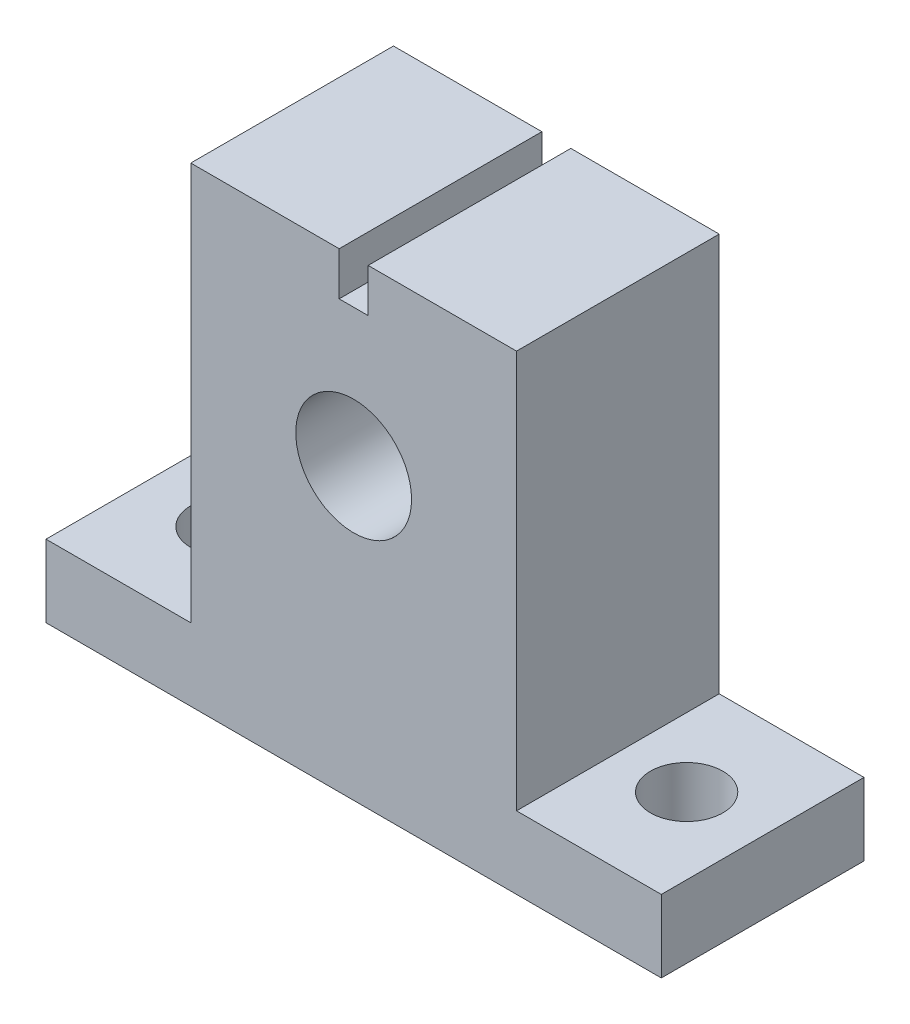
ISO-10303-21;
HEADER;
FILE_DESCRIPTION(('STEP AP214'),'2;1');
FILE_NAME('part.step','',(''),(''),'','','');
FILE_SCHEMA(('AUTOMOTIVE_DESIGN { 1 0 10303 214 1 1 1 1 }'));
ENDSEC;
DATA;
#1=APPLICATION_CONTEXT('core data for automotive mechanical design processes');
#2=APPLICATION_PROTOCOL_DEFINITION('international standard','automotive_design',2000,#1);
#3=PRODUCT_CONTEXT('',#1,'mechanical');
#4=PRODUCT('Part','Part','',(#3));
#5=PRODUCT_RELATED_PRODUCT_CATEGORY('part','',(#4));
#6=PRODUCT_DEFINITION_FORMATION('','',#4);
#7=PRODUCT_DEFINITION_CONTEXT('part definition',#1,'design');
#8=PRODUCT_DEFINITION('design','',#6,#7);
#9=PRODUCT_DEFINITION_SHAPE('','',#8);
#10=(LENGTH_UNIT() NAMED_UNIT(*) SI_UNIT(.MILLI.,.METRE.));
#11=(NAMED_UNIT(*) PLANE_ANGLE_UNIT() SI_UNIT($,.RADIAN.));
#12=(NAMED_UNIT(*) SI_UNIT($,.STERADIAN.) SOLID_ANGLE_UNIT());
#13=UNCERTAINTY_MEASURE_WITH_UNIT(LENGTH_MEASURE(1.E-05),#10,'distance_accuracy_value','');
#14=(GEOMETRIC_REPRESENTATION_CONTEXT(3) GLOBAL_UNCERTAINTY_ASSIGNED_CONTEXT((#13)) GLOBAL_UNIT_ASSIGNED_CONTEXT((#10,
#11,#12)) REPRESENTATION_CONTEXT('',''));
#15=CARTESIAN_POINT('',(0.,0.,0.));
#16=DIRECTION('',(0.,0.,1.));
#17=DIRECTION('',(1.,0.,0.));
#18=AXIS2_PLACEMENT_3D('',#15,#16,#17);
#19=CARTESIAN_POINT('',(32.5,32.5,14.));
#20=DIRECTION('',(0.,-1.,0.));
#21=DIRECTION('',(1.,0.,0.));
#22=AXIS2_PLACEMENT_3D('',#19,#20,#21);
#23=PLANE('',#22);
#24=DIRECTION('',(-1.,0.,0.));
#25=VECTOR('',#24,1.);
#26=CARTESIAN_POINT('',(32.5,32.5,14.));
#27=LINE('',#26,#25);
#28=CARTESIAN_POINT('',(20.25,32.5,14.));
#29=VERTEX_POINT('',#28);
#30=CARTESIAN_POINT('',(10.,32.5,14.));
#31=VERTEX_POINT('',#30);
#32=EDGE_CURVE('E122',#29,#31,#27,.T.);
#33=ORIENTED_EDGE('',*,*,#32,.F.);
#34=DIRECTION('',(0.,0.,1.));
#35=VECTOR('',#34,1.);
#36=CARTESIAN_POINT('',(20.25,32.5,14.));
#37=LINE('',#36,#35);
#38=CARTESIAN_POINT('',(20.25,32.5,0.));
#39=VERTEX_POINT('',#38);
#40=EDGE_CURVE('E278',#39,#29,#37,.T.);
#41=ORIENTED_EDGE('',*,*,#40,.F.);
#42=DIRECTION('',(-1.,0.,0.));
#43=VECTOR('',#42,1.);
#44=CARTESIAN_POINT('',(32.5,32.5,0.));
#45=LINE('',#44,#43);
#46=CARTESIAN_POINT('',(10.,32.5,0.));
#47=VERTEX_POINT('',#46);
#48=EDGE_CURVE('E142',#39,#47,#45,.T.);
#49=ORIENTED_EDGE('',*,*,#48,.T.);
#50=DIRECTION('',(0.,0.,-1.));
#51=VECTOR('',#50,1.);
#52=CARTESIAN_POINT('',(10.,32.5,14.));
#53=LINE('',#52,#51);
#54=EDGE_CURVE('E140',#31,#47,#53,.T.);
#55=ORIENTED_EDGE('',*,*,#54,.F.);
#56=EDGE_LOOP('',(#33,#41,#49,#55));
#57=FACE_BOUND('',#56,.T.);
#58=ADVANCED_FACE('F39',(#57),#23,.F.);
#59=CARTESIAN_POINT('',(0.,5.,14.));
#60=DIRECTION('',(1.,0.,0.));
#61=DIRECTION('',(0.,1.,0.));
#62=AXIS2_PLACEMENT_3D('',#59,#60,#61);
#63=PLANE('',#62);
#64=DIRECTION('',(0.,-1.,0.));
#65=VECTOR('',#64,1.);
#66=CARTESIAN_POINT('',(0.,5.,0.));
#67=LINE('',#66,#65);
#68=CARTESIAN_POINT('',(0.,5.,0.));
#69=VERTEX_POINT('',#68);
#70=CARTESIAN_POINT('',(0.,0.,0.));
#71=VERTEX_POINT('',#70);
#72=EDGE_CURVE('E159',#69,#71,#67,.T.);
#73=ORIENTED_EDGE('',*,*,#72,.T.);
#74=DIRECTION('',(0.,0.,-1.));
#75=VECTOR('',#74,1.);
#76=CARTESIAN_POINT('',(0.,0.,14.));
#77=LINE('',#76,#75);
#78=CARTESIAN_POINT('',(0.,0.,14.));
#79=VERTEX_POINT('',#78);
#80=EDGE_CURVE('E11',#79,#71,#77,.T.);
#81=ORIENTED_EDGE('',*,*,#80,.F.);
#82=DIRECTION('',(0.,-1.,0.));
#83=VECTOR('',#82,1.);
#84=CARTESIAN_POINT('',(0.,5.,14.));
#85=LINE('',#84,#83);
#86=CARTESIAN_POINT('',(0.,5.,14.));
#87=VERTEX_POINT('',#86);
#88=EDGE_CURVE('E185',#87,#79,#85,.T.);
#89=ORIENTED_EDGE('',*,*,#88,.F.);
#90=DIRECTION('',(0.,0.,-1.));
#91=VECTOR('',#90,1.);
#92=CARTESIAN_POINT('',(0.,5.,14.));
#93=LINE('',#92,#91);
#94=EDGE_CURVE('E154',#87,#69,#93,.T.);
#95=ORIENTED_EDGE('',*,*,#94,.T.);
#96=EDGE_LOOP('',(#73,#81,#89,#95));
#97=FACE_BOUND('',#96,.T.);
#98=ADVANCED_FACE('F41',(#97),#63,.F.);
#99=CARTESIAN_POINT('',(0.,0.,14.));
#100=DIRECTION('',(0.,1.,0.));
#101=DIRECTION('',(0.,0.,1.));
#102=AXIS2_PLACEMENT_3D('',#99,#100,#101);
#103=PLANE('',#102);
#104=CARTESIAN_POINT('',(37.25,0.,7.));
#105=DIRECTION('',(0.,1.,0.));
#106=DIRECTION('',(0.,0.,1.));
#107=AXIS2_PLACEMENT_3D('',#104,#105,#106);
#108=CIRCLE('',#107,2.5);
#109=CARTESIAN_POINT('',(37.25,0.,9.5));
#110=VERTEX_POINT('',#109);
#111=EDGE_CURVE('E250',#110,#110,#108,.T.);
#112=ORIENTED_EDGE('',*,*,#111,.T.);
#113=EDGE_LOOP('',(#112));
#114=FACE_BOUND('',#113,.T.);
#115=CARTESIAN_POINT('',(5.50000000000001,0.,7.));
#116=DIRECTION('',(0.,1.,0.));
#117=DIRECTION('',(0.,0.,1.));
#118=AXIS2_PLACEMENT_3D('',#115,#116,#117);
#119=CIRCLE('',#118,2.5);
#120=CARTESIAN_POINT('',(5.50000000000001,0.,9.5));
#121=VERTEX_POINT('',#120);
#122=EDGE_CURVE('E239',#121,#121,#119,.F.);
#123=ORIENTED_EDGE('',*,*,#122,.F.);
#124=EDGE_LOOP('',(#123));
#125=FACE_BOUND('',#124,.T.);
#126=DIRECTION('',(1.,0.,0.));
#127=VECTOR('',#126,1.);
#128=CARTESIAN_POINT('',(0.,0.,0.));
#129=LINE('',#128,#127);
#130=CARTESIAN_POINT('',(42.5,0.,0.));
#131=VERTEX_POINT('',#130);
#132=EDGE_CURVE('E163',#71,#131,#129,.T.);
#133=ORIENTED_EDGE('',*,*,#132,.T.);
#134=DIRECTION('',(0.,0.,-1.));
#135=VECTOR('',#134,1.);
#136=CARTESIAN_POINT('',(42.5,0.,14.));
#137=LINE('',#136,#135);
#138=CARTESIAN_POINT('',(42.5,0.,14.));
#139=VERTEX_POINT('',#138);
#140=EDGE_CURVE('E48',#139,#131,#137,.T.);
#141=ORIENTED_EDGE('',*,*,#140,.F.);
#142=DIRECTION('',(1.,0.,0.));
#143=VECTOR('',#142,1.);
#144=CARTESIAN_POINT('',(0.,0.,14.));
#145=LINE('',#144,#143);
#146=EDGE_CURVE('E105',#79,#139,#145,.T.);
#147=ORIENTED_EDGE('',*,*,#146,.F.);
#148=ORIENTED_EDGE('',*,*,#80,.T.);
#149=EDGE_LOOP('',(#133,#141,#147,#148));
#150=FACE_BOUND('',#149,.T.);
#151=ADVANCED_FACE('F328',(#114,#125,#150),#103,.F.);
#152=CARTESIAN_POINT('',(42.5,0.,14.));
#153=DIRECTION('',(-1.,0.,0.));
#154=DIRECTION('',(0.,0.,1.));
#155=AXIS2_PLACEMENT_3D('',#152,#153,#154);
#156=PLANE('',#155);
#157=DIRECTION('',(0.,1.,0.));
#158=VECTOR('',#157,1.);
#159=CARTESIAN_POINT('',(42.5,0.,0.));
#160=LINE('',#159,#158);
#161=CARTESIAN_POINT('',(42.5,5.,0.));
#162=VERTEX_POINT('',#161);
#163=EDGE_CURVE('E167',#131,#162,#160,.T.);
#164=ORIENTED_EDGE('',*,*,#163,.T.);
#165=DIRECTION('',(0.,0.,-1.));
#166=VECTOR('',#165,1.);
#167=CARTESIAN_POINT('',(42.5,5.,14.));
#168=LINE('',#167,#166);
#169=CARTESIAN_POINT('',(42.5,5.,14.));
#170=VERTEX_POINT('',#169);
#171=EDGE_CURVE('E197',#170,#162,#168,.T.);
#172=ORIENTED_EDGE('',*,*,#171,.F.);
#173=DIRECTION('',(0.,1.,0.));
#174=VECTOR('',#173,1.);
#175=CARTESIAN_POINT('',(42.5,0.,14.));
#176=LINE('',#175,#174);
#177=EDGE_CURVE('E207',#139,#170,#176,.T.);
#178=ORIENTED_EDGE('',*,*,#177,.F.);
#179=ORIENTED_EDGE('',*,*,#140,.T.);
#180=EDGE_LOOP('',(#164,#172,#178,#179));
#181=FACE_BOUND('',#180,.T.);
#182=ADVANCED_FACE('F205',(#181),#156,.F.);
#183=CARTESIAN_POINT('',(42.5,5.,14.));
#184=DIRECTION('',(0.,-1.,0.));
#185=DIRECTION('',(1.,0.,0.));
#186=AXIS2_PLACEMENT_3D('',#183,#184,#185);
#187=PLANE('',#186);
#188=CARTESIAN_POINT('',(37.25,5.,7.));
#189=DIRECTION('',(0.,1.,0.));
#190=DIRECTION('',(-1.,0.,0.));
#191=AXIS2_PLACEMENT_3D('',#188,#189,#190);
#192=CIRCLE('',#191,2.5);
#193=CARTESIAN_POINT('',(34.75,5.,7.));
#194=VERTEX_POINT('',#193);
#195=EDGE_CURVE('E254',#194,#194,#192,.T.);
#196=ORIENTED_EDGE('',*,*,#195,.F.);
#197=EDGE_LOOP('',(#196));
#198=FACE_BOUND('',#197,.T.);
#199=DIRECTION('',(-1.,0.,0.));
#200=VECTOR('',#199,1.);
#201=CARTESIAN_POINT('',(42.5,5.,0.));
#202=LINE('',#201,#200);
#203=CARTESIAN_POINT('',(32.5,5.,0.));
#204=VERTEX_POINT('',#203);
#205=EDGE_CURVE('E170',#162,#204,#202,.T.);
#206=ORIENTED_EDGE('',*,*,#205,.T.);
#207=DIRECTION('',(0.,0.,-1.));
#208=VECTOR('',#207,1.);
#209=CARTESIAN_POINT('',(32.5,5.,14.));
#210=LINE('',#209,#208);
#211=CARTESIAN_POINT('',(32.5,5.,14.));
#212=VERTEX_POINT('',#211);
#213=EDGE_CURVE('E193',#212,#204,#210,.T.);
#214=ORIENTED_EDGE('',*,*,#213,.F.);
#215=DIRECTION('',(-1.,0.,0.));
#216=VECTOR('',#215,1.);
#217=CARTESIAN_POINT('',(42.5,5.,14.));
#218=LINE('',#217,#216);
#219=EDGE_CURVE('E225',#170,#212,#218,.T.);
#220=ORIENTED_EDGE('',*,*,#219,.F.);
#221=ORIENTED_EDGE('',*,*,#171,.T.);
#222=EDGE_LOOP('',(#206,#214,#220,#221));
#223=FACE_BOUND('',#222,.T.);
#224=ADVANCED_FACE('F217',(#198,#223),#187,.F.);
#225=CARTESIAN_POINT('',(32.5,5.,14.));
#226=DIRECTION('',(-1.,0.,0.));
#227=DIRECTION('',(0.,0.,1.));
#228=AXIS2_PLACEMENT_3D('',#225,#226,#227);
#229=PLANE('',#228);
#230=DIRECTION('',(0.,1.,0.));
#231=VECTOR('',#230,1.);
#232=CARTESIAN_POINT('',(32.5,5.,0.));
#233=LINE('',#232,#231);
#234=CARTESIAN_POINT('',(32.5,32.5,0.));
#235=VERTEX_POINT('',#234);
#236=EDGE_CURVE('E173',#204,#235,#233,.T.);
#237=ORIENTED_EDGE('',*,*,#236,.T.);
#238=DIRECTION('',(0.,0.,-1.));
#239=VECTOR('',#238,1.);
#240=CARTESIAN_POINT('',(32.5,32.5,14.));
#241=LINE('',#240,#239);
#242=CARTESIAN_POINT('',(32.5,32.5,14.));
#243=VERTEX_POINT('',#242);
#244=EDGE_CURVE('E146',#243,#235,#241,.T.);
#245=ORIENTED_EDGE('',*,*,#244,.F.);
#246=DIRECTION('',(0.,1.,0.));
#247=VECTOR('',#246,1.);
#248=CARTESIAN_POINT('',(32.5,5.,14.));
#249=LINE('',#248,#247);
#250=EDGE_CURVE('E137',#212,#243,#249,.T.);
#251=ORIENTED_EDGE('',*,*,#250,.F.);
#252=ORIENTED_EDGE('',*,*,#213,.T.);
#253=EDGE_LOOP('',(#237,#245,#251,#252));
#254=FACE_BOUND('',#253,.T.);
#255=ADVANCED_FACE('F221',(#254),#229,.F.);
#256=CARTESIAN_POINT('',(22.25,32.5,0.));
#257=VERTEX_POINT('',#256);
#258=EDGE_CURVE('E176',#235,#257,#45,.T.);
#259=ORIENTED_EDGE('',*,*,#258,.T.);
#260=DIRECTION('',(0.,0.,-1.));
#261=VECTOR('',#260,1.);
#262=CARTESIAN_POINT('',(22.25,32.5,14.));
#263=LINE('',#262,#261);
#264=CARTESIAN_POINT('',(22.25,32.5,14.));
#265=VERTEX_POINT('',#264);
#266=EDGE_CURVE('E273',#265,#257,#263,.T.);
#267=ORIENTED_EDGE('',*,*,#266,.F.);
#268=EDGE_CURVE('E136',#243,#265,#27,.T.);
#269=ORIENTED_EDGE('',*,*,#268,.F.);
#270=ORIENTED_EDGE('',*,*,#244,.T.);
#271=EDGE_LOOP('',(#259,#267,#269,#270));
#272=FACE_BOUND('',#271,.T.);
#273=ADVANCED_FACE('F308',(#272),#23,.F.);
#274=CARTESIAN_POINT('',(10.,32.5,14.));
#275=DIRECTION('',(1.,0.,0.));
#276=DIRECTION('',(0.,1.,0.));
#277=AXIS2_PLACEMENT_3D('',#274,#275,#276);
#278=PLANE('',#277);
#279=DIRECTION('',(0.,-1.,0.));
#280=VECTOR('',#279,1.);
#281=CARTESIAN_POINT('',(10.,32.5,0.));
#282=LINE('',#281,#280);
#283=CARTESIAN_POINT('',(10.,5.,0.));
#284=VERTEX_POINT('',#283);
#285=EDGE_CURVE('E180',#47,#284,#282,.T.);
#286=ORIENTED_EDGE('',*,*,#285,.T.);
#287=DIRECTION('',(0.,0.,-1.));
#288=VECTOR('',#287,1.);
#289=CARTESIAN_POINT('',(10.,5.,14.));
#290=LINE('',#289,#288);
#291=CARTESIAN_POINT('',(10.,5.,14.));
#292=VERTEX_POINT('',#291);
#293=EDGE_CURVE('E147',#292,#284,#290,.T.);
#294=ORIENTED_EDGE('',*,*,#293,.F.);
#295=DIRECTION('',(0.,-1.,0.));
#296=VECTOR('',#295,1.);
#297=CARTESIAN_POINT('',(10.,32.5,14.));
#298=LINE('',#297,#296);
#299=EDGE_CURVE('E127',#31,#292,#298,.T.);
#300=ORIENTED_EDGE('',*,*,#299,.F.);
#301=ORIENTED_EDGE('',*,*,#54,.T.);
#302=EDGE_LOOP('',(#286,#294,#300,#301));
#303=FACE_BOUND('',#302,.T.);
#304=ADVANCED_FACE('F149',(#303),#278,.F.);
#305=CARTESIAN_POINT('',(10.,5.,14.));
#306=DIRECTION('',(0.,-1.,0.));
#307=DIRECTION('',(1.,0.,0.));
#308=AXIS2_PLACEMENT_3D('',#305,#306,#307);
#309=PLANE('',#308);
#310=CARTESIAN_POINT('',(5.5,4.99999999999999,7.));
#311=DIRECTION('',(0.,-1.,0.));
#312=DIRECTION('',(1.,0.,0.));
#313=AXIS2_PLACEMENT_3D('',#310,#311,#312);
#314=CIRCLE('',#313,2.5);
#315=CARTESIAN_POINT('',(8.00000000000001,4.99999999999999,7.));
#316=VERTEX_POINT('',#315);
#317=EDGE_CURVE('E246',#316,#316,#314,.T.);
#318=ORIENTED_EDGE('',*,*,#317,.T.);
#319=EDGE_LOOP('',(#318));
#320=FACE_BOUND('',#319,.T.);
#321=DIRECTION('',(-1.,0.,0.));
#322=VECTOR('',#321,1.);
#323=CARTESIAN_POINT('',(10.,5.,0.));
#324=LINE('',#323,#322);
#325=EDGE_CURVE('E97',#284,#69,#324,.T.);
#326=ORIENTED_EDGE('',*,*,#325,.T.);
#327=ORIENTED_EDGE('',*,*,#94,.F.);
#328=DIRECTION('',(-1.,0.,0.));
#329=VECTOR('',#328,1.);
#330=CARTESIAN_POINT('',(10.,5.,14.));
#331=LINE('',#330,#329);
#332=EDGE_CURVE('E64',#292,#87,#331,.T.);
#333=ORIENTED_EDGE('',*,*,#332,.F.);
#334=ORIENTED_EDGE('',*,*,#293,.T.);
#335=EDGE_LOOP('',(#326,#327,#333,#334));
#336=FACE_BOUND('',#335,.T.);
#337=ADVANCED_FACE('F337',(#320,#336),#309,.F.);
#338=CARTESIAN_POINT('',(0.,0.,14.));
#339=DIRECTION('',(0.,0.,1.));
#340=DIRECTION('',(1.,0.,0.));
#341=AXIS2_PLACEMENT_3D('',#338,#339,#340);
#342=PLANE('',#341);
#343=DIRECTION('',(0.,1.,0.));
#344=VECTOR('',#343,1.);
#345=CARTESIAN_POINT('',(20.25,29.5,14.));
#346=LINE('',#345,#344);
#347=CARTESIAN_POINT('',(20.25,29.5,14.));
#348=VERTEX_POINT('',#347);
#349=EDGE_CURVE('E132',#348,#29,#346,.T.);
#350=ORIENTED_EDGE('',*,*,#349,.T.);
#351=ORIENTED_EDGE('',*,*,#32,.T.);
#352=ORIENTED_EDGE('',*,*,#299,.T.);
#353=ORIENTED_EDGE('',*,*,#332,.T.);
#354=ORIENTED_EDGE('',*,*,#88,.T.);
#355=ORIENTED_EDGE('',*,*,#146,.T.);
#356=ORIENTED_EDGE('',*,*,#177,.T.);
#357=ORIENTED_EDGE('',*,*,#219,.T.);
#358=ORIENTED_EDGE('',*,*,#250,.T.);
#359=ORIENTED_EDGE('',*,*,#268,.T.);
#360=DIRECTION('',(0.,1.,0.));
#361=VECTOR('',#360,1.);
#362=CARTESIAN_POINT('',(22.25,29.5,14.));
#363=LINE('',#362,#361);
#364=CARTESIAN_POINT('',(22.25,29.5,14.));
#365=VERTEX_POINT('',#364);
#366=EDGE_CURVE('E261',#365,#265,#363,.T.);
#367=ORIENTED_EDGE('',*,*,#366,.F.);
#368=DIRECTION('',(1.,0.,0.));
#369=VECTOR('',#368,1.);
#370=CARTESIAN_POINT('',(22.25,29.5,14.));
#371=LINE('',#370,#369);
#372=EDGE_CURVE('E286',#348,#365,#371,.T.);
#373=ORIENTED_EDGE('',*,*,#372,.F.);
#374=EDGE_LOOP('',(#350,#351,#352,#353,#354,#355,#356,#357,#358,#359,#367,#373));
#375=FACE_BOUND('',#374,.T.);
#376=CARTESIAN_POINT('',(21.25,20.,14.));
#377=DIRECTION('',(0.,0.,1.));
#378=DIRECTION('',(1.,0.,0.));
#379=AXIS2_PLACEMENT_3D('',#376,#377,#378);
#380=CIRCLE('',#379,4.);
#381=CARTESIAN_POINT('',(25.25,20.,14.));
#382=VERTEX_POINT('',#381);
#383=EDGE_CURVE('E235',#382,#382,#380,.T.);
#384=ORIENTED_EDGE('',*,*,#383,.F.);
#385=EDGE_LOOP('',(#384));
#386=FACE_BOUND('',#385,.T.);
#387=ADVANCED_FACE('F124',(#375,#386),#342,.T.);
#388=CARTESIAN_POINT('',(0.,0.,0.));
#389=DIRECTION('',(0.,0.,1.));
#390=DIRECTION('',(1.,0.,0.));
#391=AXIS2_PLACEMENT_3D('',#388,#389,#390);
#392=PLANE('',#391);
#393=ORIENTED_EDGE('',*,*,#48,.F.);
#394=DIRECTION('',(0.,1.,0.));
#395=VECTOR('',#394,1.);
#396=CARTESIAN_POINT('',(20.25,29.5,0.));
#397=LINE('',#396,#395);
#398=CARTESIAN_POINT('',(20.25,29.5,0.));
#399=VERTEX_POINT('',#398);
#400=EDGE_CURVE('E258',#399,#39,#397,.T.);
#401=ORIENTED_EDGE('',*,*,#400,.F.);
#402=DIRECTION('',(-1.,0.,0.));
#403=VECTOR('',#402,1.);
#404=CARTESIAN_POINT('',(22.25,29.5,0.));
#405=LINE('',#404,#403);
#406=CARTESIAN_POINT('',(22.25,29.5,0.));
#407=VERTEX_POINT('',#406);
#408=EDGE_CURVE('E262',#407,#399,#405,.T.);
#409=ORIENTED_EDGE('',*,*,#408,.F.);
#410=DIRECTION('',(0.,1.,0.));
#411=VECTOR('',#410,1.);
#412=CARTESIAN_POINT('',(22.25,29.5,0.));
#413=LINE('',#412,#411);
#414=EDGE_CURVE('E266',#407,#257,#413,.T.);
#415=ORIENTED_EDGE('',*,*,#414,.T.);
#416=ORIENTED_EDGE('',*,*,#258,.F.);
#417=ORIENTED_EDGE('',*,*,#236,.F.);
#418=ORIENTED_EDGE('',*,*,#205,.F.);
#419=ORIENTED_EDGE('',*,*,#163,.F.);
#420=ORIENTED_EDGE('',*,*,#132,.F.);
#421=ORIENTED_EDGE('',*,*,#72,.F.);
#422=ORIENTED_EDGE('',*,*,#325,.F.);
#423=ORIENTED_EDGE('',*,*,#285,.F.);
#424=EDGE_LOOP('',(#393,#401,#409,#415,#416,#417,#418,#419,#420,#421,#422,#423));
#425=FACE_BOUND('',#424,.T.);
#426=CARTESIAN_POINT('',(21.25,20.,0.));
#427=DIRECTION('',(0.,0.,1.));
#428=DIRECTION('',(1.,0.,0.));
#429=AXIS2_PLACEMENT_3D('',#426,#427,#428);
#430=CIRCLE('',#429,4.);
#431=CARTESIAN_POINT('',(25.25,20.,0.));
#432=VERTEX_POINT('',#431);
#433=EDGE_CURVE('E164',#432,#432,#430,.T.);
#434=ORIENTED_EDGE('',*,*,#433,.T.);
#435=EDGE_LOOP('',(#434));
#436=FACE_BOUND('',#435,.T.);
#437=ADVANCED_FACE('F210',(#425,#436),#392,.F.);
#438=CARTESIAN_POINT('',(21.25,20.,0.));
#439=DIRECTION('',(0.,0.,1.));
#440=DIRECTION('',(1.,0.,0.));
#441=AXIS2_PLACEMENT_3D('',#438,#439,#440);
#442=CYLINDRICAL_SURFACE('',#441,4.);
#443=ORIENTED_EDGE('',*,*,#433,.F.);
#444=EDGE_LOOP('',(#443));
#445=FACE_BOUND('',#444,.T.);
#446=ORIENTED_EDGE('',*,*,#383,.T.);
#447=EDGE_LOOP('',(#446));
#448=FACE_BOUND('',#447,.T.);
#449=ADVANCED_FACE('F363',(#445,#448),#442,.F.);
#450=CARTESIAN_POINT('',(5.50000000000001,-9.00000000000001,7.));
#451=DIRECTION('',(0.,1.,0.));
#452=DIRECTION('',(-1.,0.,0.));
#453=AXIS2_PLACEMENT_3D('',#450,#451,#452);
#454=CYLINDRICAL_SURFACE('',#453,2.5);
#455=ORIENTED_EDGE('',*,*,#317,.F.);
#456=EDGE_LOOP('',(#455));
#457=FACE_BOUND('',#456,.T.);
#458=ORIENTED_EDGE('',*,*,#122,.T.);
#459=EDGE_LOOP('',(#458));
#460=FACE_BOUND('',#459,.T.);
#461=ADVANCED_FACE('F320',(#457,#460),#454,.F.);
#462=CARTESIAN_POINT('',(37.25,-9.,7.));
#463=DIRECTION('',(0.,1.,0.));
#464=DIRECTION('',(-1.,0.,0.));
#465=AXIS2_PLACEMENT_3D('',#462,#463,#464);
#466=CYLINDRICAL_SURFACE('',#465,2.5);
#467=ORIENTED_EDGE('',*,*,#195,.T.);
#468=EDGE_LOOP('',(#467));
#469=FACE_BOUND('',#468,.T.);
#470=ORIENTED_EDGE('',*,*,#111,.F.);
#471=EDGE_LOOP('',(#470));
#472=FACE_BOUND('',#471,.T.);
#473=ADVANCED_FACE('F313',(#469,#472),#466,.F.);
#474=CARTESIAN_POINT('',(20.25,29.5,14.));
#475=DIRECTION('',(-1.,0.,0.));
#476=DIRECTION('',(0.,-1.,0.));
#477=AXIS2_PLACEMENT_3D('',#474,#475,#476);
#478=PLANE('',#477);
#479=ORIENTED_EDGE('',*,*,#40,.T.);
#480=ORIENTED_EDGE('',*,*,#349,.F.);
#481=DIRECTION('',(0.,0.,1.));
#482=VECTOR('',#481,1.);
#483=CARTESIAN_POINT('',(20.25,29.5,14.));
#484=LINE('',#483,#482);
#485=EDGE_CURVE('E277',#399,#348,#484,.T.);
#486=ORIENTED_EDGE('',*,*,#485,.F.);
#487=ORIENTED_EDGE('',*,*,#400,.T.);
#488=EDGE_LOOP('',(#479,#480,#486,#487));
#489=FACE_BOUND('',#488,.T.);
#490=ADVANCED_FACE('F310',(#489),#478,.F.);
#491=CARTESIAN_POINT('',(22.25,29.5,14.));
#492=DIRECTION('',(1.,0.,0.));
#493=DIRECTION('',(0.,1.,0.));
#494=AXIS2_PLACEMENT_3D('',#491,#492,#493);
#495=PLANE('',#494);
#496=ORIENTED_EDGE('',*,*,#266,.T.);
#497=ORIENTED_EDGE('',*,*,#414,.F.);
#498=DIRECTION('',(0.,0.,-1.));
#499=VECTOR('',#498,1.);
#500=CARTESIAN_POINT('',(22.25,29.5,14.));
#501=LINE('',#500,#499);
#502=EDGE_CURVE('E55',#365,#407,#501,.T.);
#503=ORIENTED_EDGE('',*,*,#502,.F.);
#504=ORIENTED_EDGE('',*,*,#366,.T.);
#505=EDGE_LOOP('',(#496,#497,#503,#504));
#506=FACE_BOUND('',#505,.T.);
#507=ADVANCED_FACE('F304',(#506),#495,.F.);
#508=CARTESIAN_POINT('',(0.,29.5,0.));
#509=DIRECTION('',(0.,1.,0.));
#510=DIRECTION('',(0.,0.,1.));
#511=AXIS2_PLACEMENT_3D('',#508,#509,#510);
#512=PLANE('',#511);
#513=ORIENTED_EDGE('',*,*,#485,.T.);
#514=ORIENTED_EDGE('',*,*,#372,.T.);
#515=ORIENTED_EDGE('',*,*,#502,.T.);
#516=ORIENTED_EDGE('',*,*,#408,.T.);
#517=EDGE_LOOP('',(#513,#514,#515,#516));
#518=FACE_BOUND('',#517,.T.);
#519=ADVANCED_FACE('F293',(#518),#512,.T.);
#520=CLOSED_SHELL('',(#58,#98,#151,#182,#224,#255,#273,#304,#337,#387,#437,#449,#461,#473,#490,
#507,#519));
#521=MANIFOLD_SOLID_BREP('B2',#520);
#522=ADVANCED_BREP_SHAPE_REPRESENTATION('',(#18,#521),#14);
#523=SHAPE_DEFINITION_REPRESENTATION(#9,#522);
ENDSEC;
END-ISO-10303-21;
